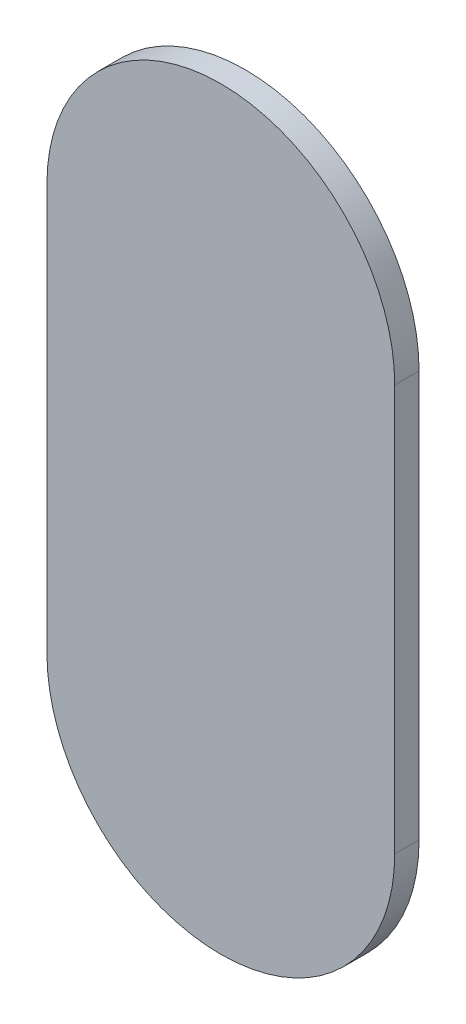
ISO-10303-21;
HEADER;
FILE_DESCRIPTION(('STEP AP214'),'2;1');
FILE_NAME('part.step','',(''),(''),'','','');
FILE_SCHEMA(('AUTOMOTIVE_DESIGN { 1 0 10303 214 1 1 1 1 }'));
ENDSEC;
DATA;
#1=APPLICATION_CONTEXT('core data for automotive mechanical design processes');
#2=APPLICATION_PROTOCOL_DEFINITION('international standard','automotive_design',2000,#1);
#3=PRODUCT_CONTEXT('',#1,'mechanical');
#4=PRODUCT('Part','Part','',(#3));
#5=PRODUCT_RELATED_PRODUCT_CATEGORY('part','',(#4));
#6=PRODUCT_DEFINITION_FORMATION('','',#4);
#7=PRODUCT_DEFINITION_CONTEXT('part definition',#1,'design');
#8=PRODUCT_DEFINITION('design','',#6,#7);
#9=PRODUCT_DEFINITION_SHAPE('','',#8);
#10=(LENGTH_UNIT() NAMED_UNIT(*) SI_UNIT(.MILLI.,.METRE.));
#11=(NAMED_UNIT(*) PLANE_ANGLE_UNIT() SI_UNIT($,.RADIAN.));
#12=(NAMED_UNIT(*) SI_UNIT($,.STERADIAN.) SOLID_ANGLE_UNIT());
#13=UNCERTAINTY_MEASURE_WITH_UNIT(LENGTH_MEASURE(1.E-05),#10,'distance_accuracy_value','');
#14=(GEOMETRIC_REPRESENTATION_CONTEXT(3) GLOBAL_UNCERTAINTY_ASSIGNED_CONTEXT((#13)) GLOBAL_UNIT_ASSIGNED_CONTEXT((#10,
#11,#12)) REPRESENTATION_CONTEXT('',''));
#15=CARTESIAN_POINT('',(0.,0.,0.));
#16=DIRECTION('',(0.,0.,1.));
#17=DIRECTION('',(1.,0.,0.));
#18=AXIS2_PLACEMENT_3D('',#15,#16,#17);
#19=CARTESIAN_POINT('',(115.261,-114.455,1.635));
#20=DIRECTION('',(0.,0.,1.));
#21=DIRECTION('',(1.,0.,0.));
#22=AXIS2_PLACEMENT_3D('',#19,#20,#21);
#23=PLANE('',#22);
#24=DIRECTION('',(0.,-1.,0.));
#25=VECTOR('',#24,1.);
#26=CARTESIAN_POINT('',(115.261,-114.455,1.635));
#27=LINE('',#26,#25);
#28=CARTESIAN_POINT('',(115.261,-114.455,1.635));
#29=VERTEX_POINT('',#28);
#30=CARTESIAN_POINT('',(115.261,-115.039,1.635));
#31=VERTEX_POINT('',#30);
#32=EDGE_CURVE('E83',#29,#31,#27,.T.);
#33=ORIENTED_EDGE('',*,*,#32,.T.);
#34=CARTESIAN_POINT('',(115.511,-115.039,1.635));
#35=DIRECTION('',(0.,0.,1.));
#36=DIRECTION('',(-1.,0.,0.));
#37=AXIS2_PLACEMENT_3D('',#34,#35,#36);
#38=CIRCLE('',#37,0.25);
#39=CARTESIAN_POINT('',(115.761,-115.039,1.635));
#40=VERTEX_POINT('',#39);
#41=EDGE_CURVE('E107',#31,#40,#38,.T.);
#42=ORIENTED_EDGE('',*,*,#41,.T.);
#43=DIRECTION('',(0.,1.,0.));
#44=VECTOR('',#43,1.);
#45=CARTESIAN_POINT('',(115.761,-115.039,1.635));
#46=LINE('',#45,#44);
#47=CARTESIAN_POINT('',(115.761,-114.455,1.635));
#48=VERTEX_POINT('',#47);
#49=EDGE_CURVE('E20',#40,#48,#46,.T.);
#50=ORIENTED_EDGE('',*,*,#49,.T.);
#51=CARTESIAN_POINT('',(115.511,-114.455,1.635));
#52=DIRECTION('',(0.,0.,1.));
#53=DIRECTION('',(1.,0.,0.));
#54=AXIS2_PLACEMENT_3D('',#51,#52,#53);
#55=CIRCLE('',#54,0.25);
#56=EDGE_CURVE('E11',#48,#29,#55,.T.);
#57=ORIENTED_EDGE('',*,*,#56,.T.);
#58=EDGE_LOOP('',(#33,#42,#50,#57));
#59=FACE_BOUND('',#58,.T.);
#60=ADVANCED_FACE('F17',(#59),#23,.T.);
#61=CARTESIAN_POINT('',(115.261,-114.455,1.6));
#62=DIRECTION('',(0.,0.,1.));
#63=DIRECTION('',(1.,0.,0.));
#64=AXIS2_PLACEMENT_3D('',#61,#62,#63);
#65=PLANE('',#64);
#66=CARTESIAN_POINT('',(115.511,-114.455,1.6));
#67=DIRECTION('',(0.,0.,1.));
#68=DIRECTION('',(1.,0.,0.));
#69=AXIS2_PLACEMENT_3D('',#66,#67,#68);
#70=CIRCLE('',#69,0.25);
#71=CARTESIAN_POINT('',(115.761,-114.455,1.6));
#72=VERTEX_POINT('',#71);
#73=CARTESIAN_POINT('',(115.261,-114.455,1.6));
#74=VERTEX_POINT('',#73);
#75=EDGE_CURVE('E26',#72,#74,#70,.T.);
#76=ORIENTED_EDGE('',*,*,#75,.F.);
#77=DIRECTION('',(0.,1.,0.));
#78=VECTOR('',#77,1.);
#79=CARTESIAN_POINT('',(115.761,-115.039,1.6));
#80=LINE('',#79,#78);
#81=CARTESIAN_POINT('',(115.761,-115.039,1.6));
#82=VERTEX_POINT('',#81);
#83=EDGE_CURVE('E111',#82,#72,#80,.T.);
#84=ORIENTED_EDGE('',*,*,#83,.F.);
#85=CARTESIAN_POINT('',(115.511,-115.039,1.6));
#86=DIRECTION('',(0.,0.,1.));
#87=DIRECTION('',(-1.,0.,0.));
#88=AXIS2_PLACEMENT_3D('',#85,#86,#87);
#89=CIRCLE('',#88,0.25);
#90=CARTESIAN_POINT('',(115.261,-115.039,1.6));
#91=VERTEX_POINT('',#90);
#92=EDGE_CURVE('E85',#91,#82,#89,.T.);
#93=ORIENTED_EDGE('',*,*,#92,.F.);
#94=DIRECTION('',(0.,-1.,0.));
#95=VECTOR('',#94,1.);
#96=CARTESIAN_POINT('',(115.261,-114.455,1.6));
#97=LINE('',#96,#95);
#98=EDGE_CURVE('E81',#74,#91,#97,.T.);
#99=ORIENTED_EDGE('',*,*,#98,.F.);
#100=EDGE_LOOP('',(#76,#84,#93,#99));
#101=FACE_BOUND('',#100,.T.);
#102=ADVANCED_FACE('F87',(#101),#65,.F.);
#103=CARTESIAN_POINT('',(115.511,-114.455,1.6));
#104=DIRECTION('',(0.,0.,-1.));
#105=DIRECTION('',(1.,0.,0.));
#106=AXIS2_PLACEMENT_3D('',#103,#104,#105);
#107=CYLINDRICAL_SURFACE('',#106,0.25);
#108=ORIENTED_EDGE('',*,*,#75,.T.);
#109=DIRECTION('',(0.,0.,1.));
#110=VECTOR('',#109,1.);
#111=CARTESIAN_POINT('',(115.261,-114.455,1.6));
#112=LINE('',#111,#110);
#113=EDGE_CURVE('E70',#74,#29,#112,.T.);
#114=ORIENTED_EDGE('',*,*,#113,.T.);
#115=ORIENTED_EDGE('',*,*,#56,.F.);
#116=DIRECTION('',(0.,0.,1.));
#117=VECTOR('',#116,1.);
#118=CARTESIAN_POINT('',(115.761,-114.455,1.6));
#119=LINE('',#118,#117);
#120=EDGE_CURVE('E73',#72,#48,#119,.T.);
#121=ORIENTED_EDGE('',*,*,#120,.F.);
#122=EDGE_LOOP('',(#108,#114,#115,#121));
#123=FACE_BOUND('',#122,.T.);
#124=ADVANCED_FACE('F69',(#123),#107,.T.);
#125=CARTESIAN_POINT('',(115.761,-115.039,1.6));
#126=DIRECTION('',(-1.,0.,0.));
#127=DIRECTION('',(0.,0.,1.));
#128=AXIS2_PLACEMENT_3D('',#125,#126,#127);
#129=PLANE('',#128);
#130=ORIENTED_EDGE('',*,*,#83,.T.);
#131=ORIENTED_EDGE('',*,*,#120,.T.);
#132=ORIENTED_EDGE('',*,*,#49,.F.);
#133=DIRECTION('',(0.,0.,1.));
#134=VECTOR('',#133,1.);
#135=CARTESIAN_POINT('',(115.761,-115.039,1.6));
#136=LINE('',#135,#134);
#137=EDGE_CURVE('E102',#82,#40,#136,.T.);
#138=ORIENTED_EDGE('',*,*,#137,.F.);
#139=EDGE_LOOP('',(#130,#131,#132,#138));
#140=FACE_BOUND('',#139,.T.);
#141=ADVANCED_FACE('F122',(#140),#129,.F.);
#142=CARTESIAN_POINT('',(115.511,-115.039,1.6));
#143=DIRECTION('',(0.,0.,-1.));
#144=DIRECTION('',(-1.,0.,0.));
#145=AXIS2_PLACEMENT_3D('',#142,#143,#144);
#146=CYLINDRICAL_SURFACE('',#145,0.25);
#147=ORIENTED_EDGE('',*,*,#92,.T.);
#148=ORIENTED_EDGE('',*,*,#137,.T.);
#149=ORIENTED_EDGE('',*,*,#41,.F.);
#150=DIRECTION('',(0.,0.,1.));
#151=VECTOR('',#150,1.);
#152=CARTESIAN_POINT('',(115.261,-115.039,1.6));
#153=LINE('',#152,#151);
#154=EDGE_CURVE('E91',#91,#31,#153,.T.);
#155=ORIENTED_EDGE('',*,*,#154,.F.);
#156=EDGE_LOOP('',(#147,#148,#149,#155));
#157=FACE_BOUND('',#156,.T.);
#158=ADVANCED_FACE('F124',(#157),#146,.T.);
#159=CARTESIAN_POINT('',(115.261,-114.455,1.6));
#160=DIRECTION('',(1.,0.,0.));
#161=DIRECTION('',(0.,1.,0.));
#162=AXIS2_PLACEMENT_3D('',#159,#160,#161);
#163=PLANE('',#162);
#164=ORIENTED_EDGE('',*,*,#98,.T.);
#165=ORIENTED_EDGE('',*,*,#154,.T.);
#166=ORIENTED_EDGE('',*,*,#32,.F.);
#167=ORIENTED_EDGE('',*,*,#113,.F.);
#168=EDGE_LOOP('',(#164,#165,#166,#167));
#169=FACE_BOUND('',#168,.T.);
#170=ADVANCED_FACE('F79',(#169),#163,.F.);
#171=CLOSED_SHELL('',(#60,#102,#124,#141,#158,#170));
#172=MANIFOLD_SOLID_BREP('B1',#171);
#173=ADVANCED_BREP_SHAPE_REPRESENTATION('',(#18,#172),#14);
#174=SHAPE_DEFINITION_REPRESENTATION(#9,#173);
ENDSEC;
END-ISO-10303-21;
